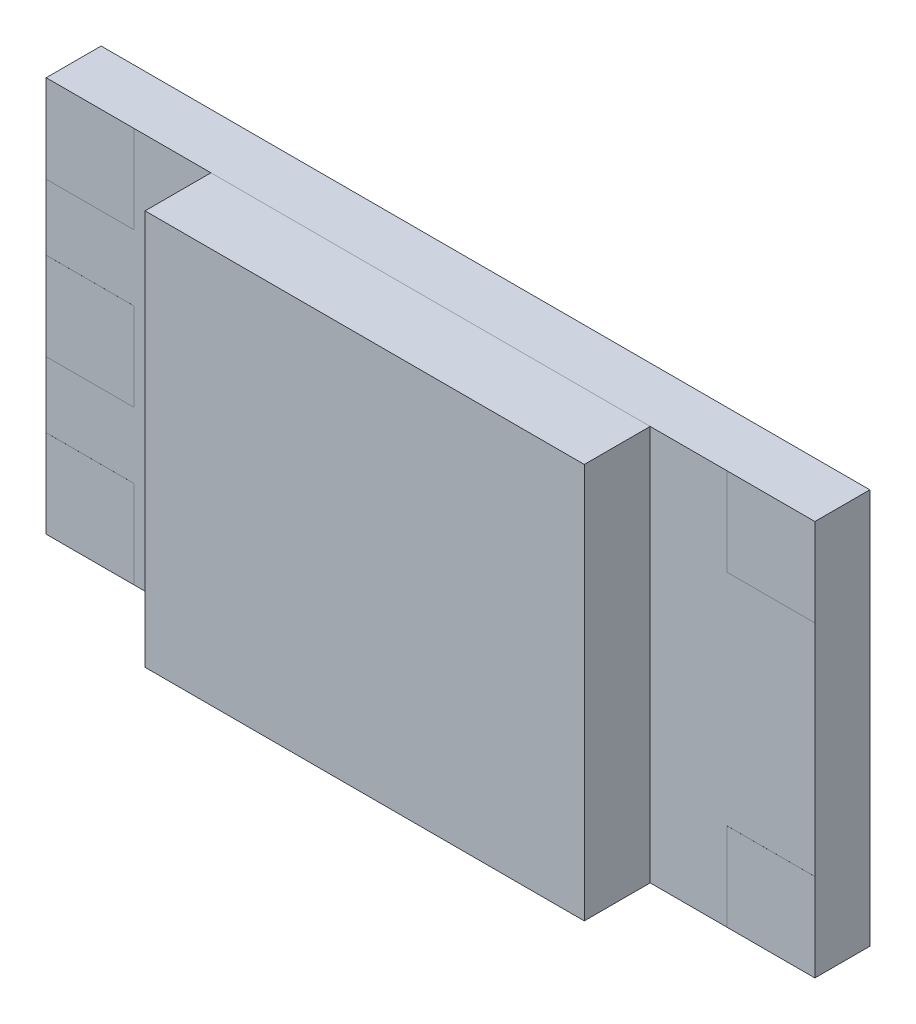
ISO-10303-21;
HEADER;
FILE_DESCRIPTION(('STEP AP214'),'2;1');
FILE_NAME('part.step','',(''),(''),'','','');
FILE_SCHEMA(('AUTOMOTIVE_DESIGN { 1 0 10303 214 1 1 1 1 }'));
ENDSEC;
DATA;
#1=APPLICATION_CONTEXT('core data for automotive mechanical design processes');
#2=APPLICATION_PROTOCOL_DEFINITION('international standard','automotive_design',2000,#1);
#3=PRODUCT_CONTEXT('',#1,'mechanical');
#4=PRODUCT('Part','Part','',(#3));
#5=PRODUCT_RELATED_PRODUCT_CATEGORY('part','',(#4));
#6=PRODUCT_DEFINITION_FORMATION('','',#4);
#7=PRODUCT_DEFINITION_CONTEXT('part definition',#1,'design');
#8=PRODUCT_DEFINITION('design','',#6,#7);
#9=PRODUCT_DEFINITION_SHAPE('','',#8);
#10=(LENGTH_UNIT() NAMED_UNIT(*) SI_UNIT(.MILLI.,.METRE.));
#11=(NAMED_UNIT(*) PLANE_ANGLE_UNIT() SI_UNIT($,.RADIAN.));
#12=(NAMED_UNIT(*) SI_UNIT($,.STERADIAN.) SOLID_ANGLE_UNIT());
#13=UNCERTAINTY_MEASURE_WITH_UNIT(LENGTH_MEASURE(1.E-05),#10,'distance_accuracy_value','');
#14=(GEOMETRIC_REPRESENTATION_CONTEXT(3) GLOBAL_UNCERTAINTY_ASSIGNED_CONTEXT((#13)) GLOBAL_UNIT_ASSIGNED_CONTEXT((#10,
#11,#12)) REPRESENTATION_CONTEXT('',''));
#15=CARTESIAN_POINT('',(0.,0.,0.));
#16=DIRECTION('',(0.,0.,1.));
#17=DIRECTION('',(1.,0.,0.));
#18=AXIS2_PLACEMENT_3D('',#15,#16,#17);
#19=CARTESIAN_POINT('',(35.,0.,2.501));
#20=DIRECTION('',(-1.,0.,0.));
#21=DIRECTION('',(0.,0.,1.));
#22=AXIS2_PLACEMENT_3D('',#19,#20,#21);
#23=PLANE('',#22);
#24=DIRECTION('',(0.,1.,0.));
#25=VECTOR('',#24,1.);
#26=CARTESIAN_POINT('',(35.,0.,2.5));
#27=LINE('',#26,#25);
#28=CARTESIAN_POINT('',(35.,0.,2.5));
#29=VERTEX_POINT('',#28);
#30=CARTESIAN_POINT('',(35.,4.,2.5));
#31=VERTEX_POINT('',#30);
#32=EDGE_CURVE('E117',#29,#31,#27,.T.);
#33=ORIENTED_EDGE('',*,*,#32,.T.);
#34=DIRECTION('',(0.,0.,-1.));
#35=VECTOR('',#34,1.);
#36=CARTESIAN_POINT('',(35.,4.,2.501));
#37=LINE('',#36,#35);
#38=CARTESIAN_POINT('',(35.,4.,2.501));
#39=VERTEX_POINT('',#38);
#40=EDGE_CURVE('E12',#39,#31,#37,.T.);
#41=ORIENTED_EDGE('',*,*,#40,.F.);
#42=DIRECTION('',(0.,1.,0.));
#43=VECTOR('',#42,1.);
#44=CARTESIAN_POINT('',(35.,0.,2.501));
#45=LINE('',#44,#43);
#46=CARTESIAN_POINT('',(35.,0.,2.501));
#47=VERTEX_POINT('',#46);
#48=EDGE_CURVE('E105',#47,#39,#45,.T.);
#49=ORIENTED_EDGE('',*,*,#48,.F.);
#50=DIRECTION('',(0.,0.,-1.));
#51=VECTOR('',#50,1.);
#52=CARTESIAN_POINT('',(35.,0.,2.501));
#53=LINE('',#52,#51);
#54=EDGE_CURVE('E113',#47,#29,#53,.T.);
#55=ORIENTED_EDGE('',*,*,#54,.T.);
#56=EDGE_LOOP('',(#33,#41,#49,#55));
#57=FACE_BOUND('',#56,.T.);
#58=ADVANCED_FACE('F54',(#57),#23,.F.);
#59=CARTESIAN_POINT('',(35.,4.,2.501));
#60=DIRECTION('',(0.,-1.,0.));
#61=DIRECTION('',(1.,0.,0.));
#62=AXIS2_PLACEMENT_3D('',#59,#60,#61);
#63=PLANE('',#62);
#64=DIRECTION('',(-1.,0.,0.));
#65=VECTOR('',#64,1.);
#66=CARTESIAN_POINT('',(35.,4.,2.5));
#67=LINE('',#66,#65);
#68=CARTESIAN_POINT('',(31.,4.,2.5));
#69=VERTEX_POINT('',#68);
#70=EDGE_CURVE('E109',#31,#69,#67,.T.);
#71=ORIENTED_EDGE('',*,*,#70,.T.);
#72=DIRECTION('',(0.,0.,-1.));
#73=VECTOR('',#72,1.);
#74=CARTESIAN_POINT('',(31.,4.,2.501));
#75=LINE('',#74,#73);
#76=CARTESIAN_POINT('',(31.,4.,2.501));
#77=VERTEX_POINT('',#76);
#78=EDGE_CURVE('E62',#77,#69,#75,.T.);
#79=ORIENTED_EDGE('',*,*,#78,.F.);
#80=DIRECTION('',(-1.,0.,0.));
#81=VECTOR('',#80,1.);
#82=CARTESIAN_POINT('',(35.,4.,2.501));
#83=LINE('',#82,#81);
#84=EDGE_CURVE('E100',#39,#77,#83,.T.);
#85=ORIENTED_EDGE('',*,*,#84,.F.);
#86=ORIENTED_EDGE('',*,*,#40,.T.);
#87=EDGE_LOOP('',(#71,#79,#85,#86));
#88=FACE_BOUND('',#87,.T.);
#89=ADVANCED_FACE('F108',(#88),#63,.F.);
#90=CARTESIAN_POINT('',(31.,0.,2.501));
#91=DIRECTION('',(1.,0.,0.));
#92=DIRECTION('',(0.,0.,-1.));
#93=AXIS2_PLACEMENT_3D('',#90,#91,#92);
#94=PLANE('',#93);
#95=DIRECTION('',(0.,-1.,0.));
#96=VECTOR('',#95,1.);
#97=CARTESIAN_POINT('',(31.,0.,2.5));
#98=LINE('',#97,#96);
#99=CARTESIAN_POINT('',(31.,0.,2.5));
#100=VERTEX_POINT('',#99);
#101=EDGE_CURVE('E87',#69,#100,#98,.T.);
#102=ORIENTED_EDGE('',*,*,#101,.T.);
#103=DIRECTION('',(0.,0.,-1.));
#104=VECTOR('',#103,1.);
#105=CARTESIAN_POINT('',(31.,0.,2.501));
#106=LINE('',#105,#104);
#107=CARTESIAN_POINT('',(31.,0.,2.501));
#108=VERTEX_POINT('',#107);
#109=EDGE_CURVE('E110',#108,#100,#106,.T.);
#110=ORIENTED_EDGE('',*,*,#109,.F.);
#111=DIRECTION('',(0.,-1.,0.));
#112=VECTOR('',#111,1.);
#113=CARTESIAN_POINT('',(31.,0.,2.501));
#114=LINE('',#113,#112);
#115=EDGE_CURVE('E103',#77,#108,#114,.T.);
#116=ORIENTED_EDGE('',*,*,#115,.F.);
#117=ORIENTED_EDGE('',*,*,#78,.T.);
#118=EDGE_LOOP('',(#102,#110,#116,#117));
#119=FACE_BOUND('',#118,.T.);
#120=ADVANCED_FACE('F111',(#119),#94,.F.);
#121=CARTESIAN_POINT('',(35.,0.,2.501));
#122=DIRECTION('',(0.,1.,0.));
#123=DIRECTION('',(-1.,0.,0.));
#124=AXIS2_PLACEMENT_3D('',#121,#122,#123);
#125=PLANE('',#124);
#126=DIRECTION('',(1.,0.,0.));
#127=VECTOR('',#126,1.);
#128=CARTESIAN_POINT('',(35.,0.,2.5));
#129=LINE('',#128,#127);
#130=EDGE_CURVE('E93',#100,#29,#129,.T.);
#131=ORIENTED_EDGE('',*,*,#130,.T.);
#132=ORIENTED_EDGE('',*,*,#54,.F.);
#133=DIRECTION('',(1.,0.,0.));
#134=VECTOR('',#133,1.);
#135=CARTESIAN_POINT('',(35.,0.,2.501));
#136=LINE('',#135,#134);
#137=EDGE_CURVE('E70',#108,#47,#136,.T.);
#138=ORIENTED_EDGE('',*,*,#137,.F.);
#139=ORIENTED_EDGE('',*,*,#109,.T.);
#140=EDGE_LOOP('',(#131,#132,#138,#139));
#141=FACE_BOUND('',#140,.T.);
#142=ADVANCED_FACE('F124',(#141),#125,.F.);
#143=CARTESIAN_POINT('',(0.,0.,2.501));
#144=DIRECTION('',(0.,0.,1.));
#145=DIRECTION('',(1.,0.,0.));
#146=AXIS2_PLACEMENT_3D('',#143,#144,#145);
#147=PLANE('',#146);
#148=ORIENTED_EDGE('',*,*,#48,.T.);
#149=ORIENTED_EDGE('',*,*,#84,.T.);
#150=ORIENTED_EDGE('',*,*,#115,.T.);
#151=ORIENTED_EDGE('',*,*,#137,.T.);
#152=EDGE_LOOP('',(#148,#149,#150,#151));
#153=FACE_BOUND('',#152,.T.);
#154=ADVANCED_FACE('F101',(#153),#147,.T.);
#155=CARTESIAN_POINT('',(0.,0.,2.5));
#156=DIRECTION('',(0.,0.,1.));
#157=DIRECTION('',(1.,0.,0.));
#158=AXIS2_PLACEMENT_3D('',#155,#156,#157);
#159=PLANE('',#158);
#160=ORIENTED_EDGE('',*,*,#32,.F.);
#161=ORIENTED_EDGE('',*,*,#130,.F.);
#162=ORIENTED_EDGE('',*,*,#101,.F.);
#163=ORIENTED_EDGE('',*,*,#70,.F.);
#164=EDGE_LOOP('',(#160,#161,#162,#163));
#165=FACE_BOUND('',#164,.T.);
#166=ADVANCED_FACE('F127',(#165),#159,.F.);
#167=CLOSED_SHELL('',(#58,#89,#120,#142,#154,#166));
#168=MANIFOLD_SOLID_BREP('B2',#167);
#169=CARTESIAN_POINT('',(35.,18.,2.501));
#170=DIRECTION('',(-1.,0.,0.));
#171=DIRECTION('',(0.,0.,1.));
#172=AXIS2_PLACEMENT_3D('',#169,#170,#171);
#173=PLANE('',#172);
#174=DIRECTION('',(0.,1.,0.));
#175=VECTOR('',#174,1.);
#176=CARTESIAN_POINT('',(35.,18.,2.5));
#177=LINE('',#176,#175);
#178=CARTESIAN_POINT('',(35.,14.,2.5));
#179=VERTEX_POINT('',#178);
#180=CARTESIAN_POINT('',(35.,18.,2.5));
#181=VERTEX_POINT('',#180);
#182=EDGE_CURVE('E263',#179,#181,#177,.T.);
#183=ORIENTED_EDGE('',*,*,#182,.T.);
#184=DIRECTION('',(0.,0.,-1.));
#185=VECTOR('',#184,1.);
#186=CARTESIAN_POINT('',(35.,18.,2.501));
#187=LINE('',#186,#185);
#188=CARTESIAN_POINT('',(35.,18.,2.501));
#189=VERTEX_POINT('',#188);
#190=EDGE_CURVE('E52',#189,#181,#187,.T.);
#191=ORIENTED_EDGE('',*,*,#190,.F.);
#192=DIRECTION('',(0.,1.,0.));
#193=VECTOR('',#192,1.);
#194=CARTESIAN_POINT('',(35.,18.,2.501));
#195=LINE('',#194,#193);
#196=CARTESIAN_POINT('',(35.,14.,2.501));
#197=VERTEX_POINT('',#196);
#198=EDGE_CURVE('E251',#197,#189,#195,.T.);
#199=ORIENTED_EDGE('',*,*,#198,.F.);
#200=DIRECTION('',(0.,0.,-1.));
#201=VECTOR('',#200,1.);
#202=CARTESIAN_POINT('',(35.,14.,2.501));
#203=LINE('',#202,#201);
#204=EDGE_CURVE('E259',#197,#179,#203,.T.);
#205=ORIENTED_EDGE('',*,*,#204,.T.);
#206=EDGE_LOOP('',(#183,#191,#199,#205));
#207=FACE_BOUND('',#206,.T.);
#208=ADVANCED_FACE('F200',(#207),#173,.F.);
#209=CARTESIAN_POINT('',(35.,18.,2.501));
#210=DIRECTION('',(0.,-1.,0.));
#211=DIRECTION('',(0.,0.,-1.));
#212=AXIS2_PLACEMENT_3D('',#209,#210,#211);
#213=PLANE('',#212);
#214=DIRECTION('',(-1.,0.,0.));
#215=VECTOR('',#214,1.);
#216=CARTESIAN_POINT('',(35.,18.,2.5));
#217=LINE('',#216,#215);
#218=CARTESIAN_POINT('',(31.,18.,2.5));
#219=VERTEX_POINT('',#218);
#220=EDGE_CURVE('E255',#181,#219,#217,.T.);
#221=ORIENTED_EDGE('',*,*,#220,.T.);
#222=DIRECTION('',(0.,0.,-1.));
#223=VECTOR('',#222,1.);
#224=CARTESIAN_POINT('',(31.,18.,2.501));
#225=LINE('',#224,#223);
#226=CARTESIAN_POINT('',(31.,18.,2.501));
#227=VERTEX_POINT('',#226);
#228=EDGE_CURVE('E208',#227,#219,#225,.T.);
#229=ORIENTED_EDGE('',*,*,#228,.F.);
#230=DIRECTION('',(-1.,0.,0.));
#231=VECTOR('',#230,1.);
#232=CARTESIAN_POINT('',(35.,18.,2.501));
#233=LINE('',#232,#231);
#234=EDGE_CURVE('E246',#189,#227,#233,.T.);
#235=ORIENTED_EDGE('',*,*,#234,.F.);
#236=ORIENTED_EDGE('',*,*,#190,.T.);
#237=EDGE_LOOP('',(#221,#229,#235,#236));
#238=FACE_BOUND('',#237,.T.);
#239=ADVANCED_FACE('F254',(#238),#213,.F.);
#240=CARTESIAN_POINT('',(31.,18.,2.501));
#241=DIRECTION('',(1.,0.,0.));
#242=DIRECTION('',(0.,1.,0.));
#243=AXIS2_PLACEMENT_3D('',#240,#241,#242);
#244=PLANE('',#243);
#245=DIRECTION('',(0.,-1.,0.));
#246=VECTOR('',#245,1.);
#247=CARTESIAN_POINT('',(31.,18.,2.5));
#248=LINE('',#247,#246);
#249=CARTESIAN_POINT('',(31.,14.,2.5));
#250=VERTEX_POINT('',#249);
#251=EDGE_CURVE('E233',#219,#250,#248,.T.);
#252=ORIENTED_EDGE('',*,*,#251,.T.);
#253=DIRECTION('',(0.,0.,-1.));
#254=VECTOR('',#253,1.);
#255=CARTESIAN_POINT('',(31.,14.,2.501));
#256=LINE('',#255,#254);
#257=CARTESIAN_POINT('',(31.,14.,2.501));
#258=VERTEX_POINT('',#257);
#259=EDGE_CURVE('E256',#258,#250,#256,.T.);
#260=ORIENTED_EDGE('',*,*,#259,.F.);
#261=DIRECTION('',(0.,-1.,0.));
#262=VECTOR('',#261,1.);
#263=CARTESIAN_POINT('',(31.,18.,2.501));
#264=LINE('',#263,#262);
#265=EDGE_CURVE('E249',#227,#258,#264,.T.);
#266=ORIENTED_EDGE('',*,*,#265,.F.);
#267=ORIENTED_EDGE('',*,*,#228,.T.);
#268=EDGE_LOOP('',(#252,#260,#266,#267));
#269=FACE_BOUND('',#268,.T.);
#270=ADVANCED_FACE('F257',(#269),#244,.F.);
#271=CARTESIAN_POINT('',(35.,14.,2.501));
#272=DIRECTION('',(0.,1.,0.));
#273=DIRECTION('',(0.,0.,1.));
#274=AXIS2_PLACEMENT_3D('',#271,#272,#273);
#275=PLANE('',#274);
#276=DIRECTION('',(1.,0.,0.));
#277=VECTOR('',#276,1.);
#278=CARTESIAN_POINT('',(35.,14.,2.5));
#279=LINE('',#278,#277);
#280=EDGE_CURVE('E239',#250,#179,#279,.T.);
#281=ORIENTED_EDGE('',*,*,#280,.T.);
#282=ORIENTED_EDGE('',*,*,#204,.F.);
#283=DIRECTION('',(1.,0.,0.));
#284=VECTOR('',#283,1.);
#285=CARTESIAN_POINT('',(35.,14.,2.501));
#286=LINE('',#285,#284);
#287=EDGE_CURVE('E216',#258,#197,#286,.T.);
#288=ORIENTED_EDGE('',*,*,#287,.F.);
#289=ORIENTED_EDGE('',*,*,#259,.T.);
#290=EDGE_LOOP('',(#281,#282,#288,#289));
#291=FACE_BOUND('',#290,.T.);
#292=ADVANCED_FACE('F270',(#291),#275,.F.);
#293=CARTESIAN_POINT('',(0.,0.,2.501));
#294=DIRECTION('',(0.,0.,-1.));
#295=DIRECTION('',(-1.,0.,0.));
#296=AXIS2_PLACEMENT_3D('',#293,#294,#295);
#297=PLANE('',#296);
#298=ORIENTED_EDGE('',*,*,#198,.T.);
#299=ORIENTED_EDGE('',*,*,#234,.T.);
#300=ORIENTED_EDGE('',*,*,#265,.T.);
#301=ORIENTED_EDGE('',*,*,#287,.T.);
#302=EDGE_LOOP('',(#298,#299,#300,#301));
#303=FACE_BOUND('',#302,.T.);
#304=ADVANCED_FACE('F247',(#303),#297,.F.);
#305=CARTESIAN_POINT('',(0.,0.,2.5));
#306=DIRECTION('',(0.,0.,-1.));
#307=DIRECTION('',(-1.,0.,0.));
#308=AXIS2_PLACEMENT_3D('',#305,#306,#307);
#309=PLANE('',#308);
#310=ORIENTED_EDGE('',*,*,#182,.F.);
#311=ORIENTED_EDGE('',*,*,#280,.F.);
#312=ORIENTED_EDGE('',*,*,#251,.F.);
#313=ORIENTED_EDGE('',*,*,#220,.F.);
#314=EDGE_LOOP('',(#310,#311,#312,#313));
#315=FACE_BOUND('',#314,.T.);
#316=ADVANCED_FACE('F273',(#315),#309,.T.);
#317=CLOSED_SHELL('',(#208,#239,#270,#292,#304,#316));
#318=MANIFOLD_SOLID_BREP('B6',#317);
#319=CARTESIAN_POINT('',(0.,0.,2.501));
#320=DIRECTION('',(1.,0.,0.));
#321=DIRECTION('',(0.,0.,-1.));
#322=AXIS2_PLACEMENT_3D('',#319,#320,#321);
#323=PLANE('',#322);
#324=DIRECTION('',(0.,-1.,0.));
#325=VECTOR('',#324,1.);
#326=CARTESIAN_POINT('',(0.,0.,2.5));
#327=LINE('',#326,#325);
#328=CARTESIAN_POINT('',(0.,4.,2.5));
#329=VERTEX_POINT('',#328);
#330=CARTESIAN_POINT('',(0.,0.,2.5));
#331=VERTEX_POINT('',#330);
#332=EDGE_CURVE('E409',#329,#331,#327,.T.);
#333=ORIENTED_EDGE('',*,*,#332,.T.);
#334=DIRECTION('',(0.,0.,-1.));
#335=VECTOR('',#334,1.);
#336=CARTESIAN_POINT('',(0.,0.,2.501));
#337=LINE('',#336,#335);
#338=CARTESIAN_POINT('',(0.,0.,2.501));
#339=VERTEX_POINT('',#338);
#340=EDGE_CURVE('E198',#339,#331,#337,.T.);
#341=ORIENTED_EDGE('',*,*,#340,.F.);
#342=DIRECTION('',(0.,-1.,0.));
#343=VECTOR('',#342,1.);
#344=CARTESIAN_POINT('',(0.,0.,2.501));
#345=LINE('',#344,#343);
#346=CARTESIAN_POINT('',(0.,4.,2.501));
#347=VERTEX_POINT('',#346);
#348=EDGE_CURVE('E397',#347,#339,#345,.T.);
#349=ORIENTED_EDGE('',*,*,#348,.F.);
#350=DIRECTION('',(0.,0.,-1.));
#351=VECTOR('',#350,1.);
#352=CARTESIAN_POINT('',(0.,4.,2.501));
#353=LINE('',#352,#351);
#354=EDGE_CURVE('E405',#347,#329,#353,.T.);
#355=ORIENTED_EDGE('',*,*,#354,.T.);
#356=EDGE_LOOP('',(#333,#341,#349,#355));
#357=FACE_BOUND('',#356,.T.);
#358=ADVANCED_FACE('F346',(#357),#323,.F.);
#359=CARTESIAN_POINT('',(0.,0.,2.501));
#360=DIRECTION('',(0.,1.,0.));
#361=DIRECTION('',(0.,0.,1.));
#362=AXIS2_PLACEMENT_3D('',#359,#360,#361);
#363=PLANE('',#362);
#364=DIRECTION('',(1.,0.,0.));
#365=VECTOR('',#364,1.);
#366=CARTESIAN_POINT('',(0.,0.,2.5));
#367=LINE('',#366,#365);
#368=CARTESIAN_POINT('',(4.,0.,2.5));
#369=VERTEX_POINT('',#368);
#370=EDGE_CURVE('E401',#331,#369,#367,.T.);
#371=ORIENTED_EDGE('',*,*,#370,.T.);
#372=DIRECTION('',(0.,0.,-1.));
#373=VECTOR('',#372,1.);
#374=CARTESIAN_POINT('',(4.,0.,2.501));
#375=LINE('',#374,#373);
#376=CARTESIAN_POINT('',(4.,0.,2.501));
#377=VERTEX_POINT('',#376);
#378=EDGE_CURVE('E354',#377,#369,#375,.T.);
#379=ORIENTED_EDGE('',*,*,#378,.F.);
#380=DIRECTION('',(1.,0.,0.));
#381=VECTOR('',#380,1.);
#382=CARTESIAN_POINT('',(0.,0.,2.501));
#383=LINE('',#382,#381);
#384=EDGE_CURVE('E392',#339,#377,#383,.T.);
#385=ORIENTED_EDGE('',*,*,#384,.F.);
#386=ORIENTED_EDGE('',*,*,#340,.T.);
#387=EDGE_LOOP('',(#371,#379,#385,#386));
#388=FACE_BOUND('',#387,.T.);
#389=ADVANCED_FACE('F400',(#388),#363,.F.);
#390=CARTESIAN_POINT('',(4.,0.,2.501));
#391=DIRECTION('',(-1.,0.,0.));
#392=DIRECTION('',(0.,0.,1.));
#393=AXIS2_PLACEMENT_3D('',#390,#391,#392);
#394=PLANE('',#393);
#395=DIRECTION('',(0.,1.,0.));
#396=VECTOR('',#395,1.);
#397=CARTESIAN_POINT('',(4.,0.,2.5));
#398=LINE('',#397,#396);
#399=CARTESIAN_POINT('',(4.,4.,2.5));
#400=VERTEX_POINT('',#399);
#401=EDGE_CURVE('E379',#369,#400,#398,.T.);
#402=ORIENTED_EDGE('',*,*,#401,.T.);
#403=DIRECTION('',(0.,0.,-1.));
#404=VECTOR('',#403,1.);
#405=CARTESIAN_POINT('',(4.,4.,2.501));
#406=LINE('',#405,#404);
#407=CARTESIAN_POINT('',(4.,4.,2.501));
#408=VERTEX_POINT('',#407);
#409=EDGE_CURVE('E402',#408,#400,#406,.T.);
#410=ORIENTED_EDGE('',*,*,#409,.F.);
#411=DIRECTION('',(0.,1.,0.));
#412=VECTOR('',#411,1.);
#413=CARTESIAN_POINT('',(4.,0.,2.501));
#414=LINE('',#413,#412);
#415=EDGE_CURVE('E395',#377,#408,#414,.T.);
#416=ORIENTED_EDGE('',*,*,#415,.F.);
#417=ORIENTED_EDGE('',*,*,#378,.T.);
#418=EDGE_LOOP('',(#402,#410,#416,#417));
#419=FACE_BOUND('',#418,.T.);
#420=ADVANCED_FACE('F403',(#419),#394,.F.);
#421=CARTESIAN_POINT('',(0.,4.,2.501));
#422=DIRECTION('',(0.,-1.,0.));
#423=DIRECTION('',(0.,0.,-1.));
#424=AXIS2_PLACEMENT_3D('',#421,#422,#423);
#425=PLANE('',#424);
#426=DIRECTION('',(-1.,0.,0.));
#427=VECTOR('',#426,1.);
#428=CARTESIAN_POINT('',(0.,4.,2.5));
#429=LINE('',#428,#427);
#430=EDGE_CURVE('E385',#400,#329,#429,.T.);
#431=ORIENTED_EDGE('',*,*,#430,.T.);
#432=ORIENTED_EDGE('',*,*,#354,.F.);
#433=DIRECTION('',(-1.,0.,0.));
#434=VECTOR('',#433,1.);
#435=CARTESIAN_POINT('',(0.,4.,2.501));
#436=LINE('',#435,#434);
#437=EDGE_CURVE('E362',#408,#347,#436,.T.);
#438=ORIENTED_EDGE('',*,*,#437,.F.);
#439=ORIENTED_EDGE('',*,*,#409,.T.);
#440=EDGE_LOOP('',(#431,#432,#438,#439));
#441=FACE_BOUND('',#440,.T.);
#442=ADVANCED_FACE('F416',(#441),#425,.F.);
#443=CARTESIAN_POINT('',(0.,0.,2.501));
#444=DIRECTION('',(0.,0.,-1.));
#445=DIRECTION('',(-1.,0.,0.));
#446=AXIS2_PLACEMENT_3D('',#443,#444,#445);
#447=PLANE('',#446);
#448=ORIENTED_EDGE('',*,*,#348,.T.);
#449=ORIENTED_EDGE('',*,*,#384,.T.);
#450=ORIENTED_EDGE('',*,*,#415,.T.);
#451=ORIENTED_EDGE('',*,*,#437,.T.);
#452=EDGE_LOOP('',(#448,#449,#450,#451));
#453=FACE_BOUND('',#452,.T.);
#454=ADVANCED_FACE('F393',(#453),#447,.F.);
#455=CARTESIAN_POINT('',(0.,0.,2.5));
#456=DIRECTION('',(0.,0.,-1.));
#457=DIRECTION('',(-1.,0.,0.));
#458=AXIS2_PLACEMENT_3D('',#455,#456,#457);
#459=PLANE('',#458);
#460=ORIENTED_EDGE('',*,*,#332,.F.);
#461=ORIENTED_EDGE('',*,*,#430,.F.);
#462=ORIENTED_EDGE('',*,*,#401,.F.);
#463=ORIENTED_EDGE('',*,*,#370,.F.);
#464=EDGE_LOOP('',(#460,#461,#462,#463));
#465=FACE_BOUND('',#464,.T.);
#466=ADVANCED_FACE('F419',(#465),#459,.T.);
#467=CLOSED_SHELL('',(#358,#389,#420,#442,#454,#466));
#468=MANIFOLD_SOLID_BREP('B46',#467);
#469=CARTESIAN_POINT('',(0.,11.,2.501));
#470=DIRECTION('',(1.,0.,0.));
#471=DIRECTION('',(0.,1.,0.));
#472=AXIS2_PLACEMENT_3D('',#469,#470,#471);
#473=PLANE('',#472);
#474=DIRECTION('',(0.,-1.,0.));
#475=VECTOR('',#474,1.);
#476=CARTESIAN_POINT('',(0.,11.,2.5));
#477=LINE('',#476,#475);
#478=CARTESIAN_POINT('',(0.,11.,2.5));
#479=VERTEX_POINT('',#478);
#480=CARTESIAN_POINT('',(0.,7.,2.5));
#481=VERTEX_POINT('',#480);
#482=EDGE_CURVE('E555',#479,#481,#477,.T.);
#483=ORIENTED_EDGE('',*,*,#482,.T.);
#484=DIRECTION('',(0.,0.,-1.));
#485=VECTOR('',#484,1.);
#486=CARTESIAN_POINT('',(0.,7.,2.501));
#487=LINE('',#486,#485);
#488=CARTESIAN_POINT('',(0.,7.,2.501));
#489=VERTEX_POINT('',#488);
#490=EDGE_CURVE('E344',#489,#481,#487,.T.);
#491=ORIENTED_EDGE('',*,*,#490,.F.);
#492=DIRECTION('',(0.,-1.,0.));
#493=VECTOR('',#492,1.);
#494=CARTESIAN_POINT('',(0.,11.,2.501));
#495=LINE('',#494,#493);
#496=CARTESIAN_POINT('',(0.,11.,2.501));
#497=VERTEX_POINT('',#496);
#498=EDGE_CURVE('E543',#497,#489,#495,.T.);
#499=ORIENTED_EDGE('',*,*,#498,.F.);
#500=DIRECTION('',(0.,0.,-1.));
#501=VECTOR('',#500,1.);
#502=CARTESIAN_POINT('',(0.,11.,2.501));
#503=LINE('',#502,#501);
#504=EDGE_CURVE('E551',#497,#479,#503,.T.);
#505=ORIENTED_EDGE('',*,*,#504,.T.);
#506=EDGE_LOOP('',(#483,#491,#499,#505));
#507=FACE_BOUND('',#506,.T.);
#508=ADVANCED_FACE('F492',(#507),#473,.F.);
#509=CARTESIAN_POINT('',(0.,7.,2.501));
#510=DIRECTION('',(0.,1.,0.));
#511=DIRECTION('',(-1.,0.,0.));
#512=AXIS2_PLACEMENT_3D('',#509,#510,#511);
#513=PLANE('',#512);
#514=DIRECTION('',(1.,0.,0.));
#515=VECTOR('',#514,1.);
#516=CARTESIAN_POINT('',(0.,7.,2.5));
#517=LINE('',#516,#515);
#518=CARTESIAN_POINT('',(4.,7.,2.5));
#519=VERTEX_POINT('',#518);
#520=EDGE_CURVE('E547',#481,#519,#517,.T.);
#521=ORIENTED_EDGE('',*,*,#520,.T.);
#522=DIRECTION('',(0.,0.,-1.));
#523=VECTOR('',#522,1.);
#524=CARTESIAN_POINT('',(4.,7.,2.501));
#525=LINE('',#524,#523);
#526=CARTESIAN_POINT('',(4.,7.,2.501));
#527=VERTEX_POINT('',#526);
#528=EDGE_CURVE('E500',#527,#519,#525,.T.);
#529=ORIENTED_EDGE('',*,*,#528,.F.);
#530=DIRECTION('',(1.,0.,0.));
#531=VECTOR('',#530,1.);
#532=CARTESIAN_POINT('',(0.,7.,2.501));
#533=LINE('',#532,#531);
#534=EDGE_CURVE('E538',#489,#527,#533,.T.);
#535=ORIENTED_EDGE('',*,*,#534,.F.);
#536=ORIENTED_EDGE('',*,*,#490,.T.);
#537=EDGE_LOOP('',(#521,#529,#535,#536));
#538=FACE_BOUND('',#537,.T.);
#539=ADVANCED_FACE('F546',(#538),#513,.F.);
#540=CARTESIAN_POINT('',(4.,11.,2.501));
#541=DIRECTION('',(-1.,0.,0.));
#542=DIRECTION('',(0.,0.,1.));
#543=AXIS2_PLACEMENT_3D('',#540,#541,#542);
#544=PLANE('',#543);
#545=DIRECTION('',(0.,1.,0.));
#546=VECTOR('',#545,1.);
#547=CARTESIAN_POINT('',(4.,11.,2.5));
#548=LINE('',#547,#546);
#549=CARTESIAN_POINT('',(4.,11.,2.5));
#550=VERTEX_POINT('',#549);
#551=EDGE_CURVE('E525',#519,#550,#548,.T.);
#552=ORIENTED_EDGE('',*,*,#551,.T.);
#553=DIRECTION('',(0.,0.,-1.));
#554=VECTOR('',#553,1.);
#555=CARTESIAN_POINT('',(4.,11.,2.501));
#556=LINE('',#555,#554);
#557=CARTESIAN_POINT('',(4.,11.,2.501));
#558=VERTEX_POINT('',#557);
#559=EDGE_CURVE('E548',#558,#550,#556,.T.);
#560=ORIENTED_EDGE('',*,*,#559,.F.);
#561=DIRECTION('',(0.,1.,0.));
#562=VECTOR('',#561,1.);
#563=CARTESIAN_POINT('',(4.,11.,2.501));
#564=LINE('',#563,#562);
#565=EDGE_CURVE('E541',#527,#558,#564,.T.);
#566=ORIENTED_EDGE('',*,*,#565,.F.);
#567=ORIENTED_EDGE('',*,*,#528,.T.);
#568=EDGE_LOOP('',(#552,#560,#566,#567));
#569=FACE_BOUND('',#568,.T.);
#570=ADVANCED_FACE('F549',(#569),#544,.F.);
#571=CARTESIAN_POINT('',(0.,11.,2.501));
#572=DIRECTION('',(0.,-1.,0.));
#573=DIRECTION('',(1.,0.,0.));
#574=AXIS2_PLACEMENT_3D('',#571,#572,#573);
#575=PLANE('',#574);
#576=DIRECTION('',(-1.,0.,0.));
#577=VECTOR('',#576,1.);
#578=CARTESIAN_POINT('',(0.,11.,2.5));
#579=LINE('',#578,#577);
#580=EDGE_CURVE('E531',#550,#479,#579,.T.);
#581=ORIENTED_EDGE('',*,*,#580,.T.);
#582=ORIENTED_EDGE('',*,*,#504,.F.);
#583=DIRECTION('',(-1.,0.,0.));
#584=VECTOR('',#583,1.);
#585=CARTESIAN_POINT('',(0.,11.,2.501));
#586=LINE('',#585,#584);
#587=EDGE_CURVE('E508',#558,#497,#586,.T.);
#588=ORIENTED_EDGE('',*,*,#587,.F.);
#589=ORIENTED_EDGE('',*,*,#559,.T.);
#590=EDGE_LOOP('',(#581,#582,#588,#589));
#591=FACE_BOUND('',#590,.T.);
#592=ADVANCED_FACE('F562',(#591),#575,.F.);
#593=CARTESIAN_POINT('',(0.,0.,2.501));
#594=DIRECTION('',(0.,0.,1.));
#595=DIRECTION('',(1.,0.,0.));
#596=AXIS2_PLACEMENT_3D('',#593,#594,#595);
#597=PLANE('',#596);
#598=ORIENTED_EDGE('',*,*,#498,.T.);
#599=ORIENTED_EDGE('',*,*,#534,.T.);
#600=ORIENTED_EDGE('',*,*,#565,.T.);
#601=ORIENTED_EDGE('',*,*,#587,.T.);
#602=EDGE_LOOP('',(#598,#599,#600,#601));
#603=FACE_BOUND('',#602,.T.);
#604=ADVANCED_FACE('F539',(#603),#597,.T.);
#605=CARTESIAN_POINT('',(0.,0.,2.5));
#606=DIRECTION('',(0.,0.,1.));
#607=DIRECTION('',(1.,0.,0.));
#608=AXIS2_PLACEMENT_3D('',#605,#606,#607);
#609=PLANE('',#608);
#610=ORIENTED_EDGE('',*,*,#482,.F.);
#611=ORIENTED_EDGE('',*,*,#580,.F.);
#612=ORIENTED_EDGE('',*,*,#551,.F.);
#613=ORIENTED_EDGE('',*,*,#520,.F.);
#614=EDGE_LOOP('',(#610,#611,#612,#613));
#615=FACE_BOUND('',#614,.T.);
#616=ADVANCED_FACE('F565',(#615),#609,.F.);
#617=CLOSED_SHELL('',(#508,#539,#570,#592,#604,#616));
#618=MANIFOLD_SOLID_BREP('B192',#617);
#619=CARTESIAN_POINT('',(0.,18.,2.501));
#620=DIRECTION('',(1.,0.,0.));
#621=DIRECTION('',(0.,1.,0.));
#622=AXIS2_PLACEMENT_3D('',#619,#620,#621);
#623=PLANE('',#622);
#624=DIRECTION('',(0.,-1.,0.));
#625=VECTOR('',#624,1.);
#626=CARTESIAN_POINT('',(0.,18.,2.5));
#627=LINE('',#626,#625);
#628=CARTESIAN_POINT('',(0.,18.,2.5));
#629=VERTEX_POINT('',#628);
#630=CARTESIAN_POINT('',(0.,14.,2.5));
#631=VERTEX_POINT('',#630);
#632=EDGE_CURVE('E701',#629,#631,#627,.T.);
#633=ORIENTED_EDGE('',*,*,#632,.T.);
#634=DIRECTION('',(0.,0.,-1.));
#635=VECTOR('',#634,1.);
#636=CARTESIAN_POINT('',(0.,14.,2.501));
#637=LINE('',#636,#635);
#638=CARTESIAN_POINT('',(0.,14.,2.501));
#639=VERTEX_POINT('',#638);
#640=EDGE_CURVE('E490',#639,#631,#637,.T.);
#641=ORIENTED_EDGE('',*,*,#640,.F.);
#642=DIRECTION('',(0.,-1.,0.));
#643=VECTOR('',#642,1.);
#644=CARTESIAN_POINT('',(0.,18.,2.501));
#645=LINE('',#644,#643);
#646=CARTESIAN_POINT('',(0.,18.,2.501));
#647=VERTEX_POINT('',#646);
#648=EDGE_CURVE('E689',#647,#639,#645,.T.);
#649=ORIENTED_EDGE('',*,*,#648,.F.);
#650=DIRECTION('',(0.,0.,-1.));
#651=VECTOR('',#650,1.);
#652=CARTESIAN_POINT('',(0.,18.,2.501));
#653=LINE('',#652,#651);
#654=EDGE_CURVE('E697',#647,#629,#653,.T.);
#655=ORIENTED_EDGE('',*,*,#654,.T.);
#656=EDGE_LOOP('',(#633,#641,#649,#655));
#657=FACE_BOUND('',#656,.T.);
#658=ADVANCED_FACE('F638',(#657),#623,.F.);
#659=CARTESIAN_POINT('',(0.,14.,2.501));
#660=DIRECTION('',(0.,1.,0.));
#661=DIRECTION('',(0.,0.,1.));
#662=AXIS2_PLACEMENT_3D('',#659,#660,#661);
#663=PLANE('',#662);
#664=DIRECTION('',(1.,0.,0.));
#665=VECTOR('',#664,1.);
#666=CARTESIAN_POINT('',(0.,14.,2.5));
#667=LINE('',#666,#665);
#668=CARTESIAN_POINT('',(4.,14.,2.5));
#669=VERTEX_POINT('',#668);
#670=EDGE_CURVE('E693',#631,#669,#667,.T.);
#671=ORIENTED_EDGE('',*,*,#670,.T.);
#672=DIRECTION('',(0.,0.,-1.));
#673=VECTOR('',#672,1.);
#674=CARTESIAN_POINT('',(4.,14.,2.501));
#675=LINE('',#674,#673);
#676=CARTESIAN_POINT('',(4.,14.,2.501));
#677=VERTEX_POINT('',#676);
#678=EDGE_CURVE('E646',#677,#669,#675,.T.);
#679=ORIENTED_EDGE('',*,*,#678,.F.);
#680=DIRECTION('',(1.,0.,0.));
#681=VECTOR('',#680,1.);
#682=CARTESIAN_POINT('',(0.,14.,2.501));
#683=LINE('',#682,#681);
#684=EDGE_CURVE('E684',#639,#677,#683,.T.);
#685=ORIENTED_EDGE('',*,*,#684,.F.);
#686=ORIENTED_EDGE('',*,*,#640,.T.);
#687=EDGE_LOOP('',(#671,#679,#685,#686));
#688=FACE_BOUND('',#687,.T.);
#689=ADVANCED_FACE('F692',(#688),#663,.F.);
#690=CARTESIAN_POINT('',(4.,18.,2.501));
#691=DIRECTION('',(-1.,0.,0.));
#692=DIRECTION('',(0.,-1.,0.));
#693=AXIS2_PLACEMENT_3D('',#690,#691,#692);
#694=PLANE('',#693);
#695=DIRECTION('',(0.,1.,0.));
#696=VECTOR('',#695,1.);
#697=CARTESIAN_POINT('',(4.,18.,2.5));
#698=LINE('',#697,#696);
#699=CARTESIAN_POINT('',(4.,18.,2.5));
#700=VERTEX_POINT('',#699);
#701=EDGE_CURVE('E671',#669,#700,#698,.T.);
#702=ORIENTED_EDGE('',*,*,#701,.T.);
#703=DIRECTION('',(0.,0.,-1.));
#704=VECTOR('',#703,1.);
#705=CARTESIAN_POINT('',(4.,18.,2.501));
#706=LINE('',#705,#704);
#707=CARTESIAN_POINT('',(4.,18.,2.501));
#708=VERTEX_POINT('',#707);
#709=EDGE_CURVE('E694',#708,#700,#706,.T.);
#710=ORIENTED_EDGE('',*,*,#709,.F.);
#711=DIRECTION('',(0.,1.,0.));
#712=VECTOR('',#711,1.);
#713=CARTESIAN_POINT('',(4.,18.,2.501));
#714=LINE('',#713,#712);
#715=EDGE_CURVE('E687',#677,#708,#714,.T.);
#716=ORIENTED_EDGE('',*,*,#715,.F.);
#717=ORIENTED_EDGE('',*,*,#678,.T.);
#718=EDGE_LOOP('',(#702,#710,#716,#717));
#719=FACE_BOUND('',#718,.T.);
#720=ADVANCED_FACE('F695',(#719),#694,.F.);
#721=CARTESIAN_POINT('',(0.,18.,2.501));
#722=DIRECTION('',(0.,-1.,0.));
#723=DIRECTION('',(0.,0.,-1.));
#724=AXIS2_PLACEMENT_3D('',#721,#722,#723);
#725=PLANE('',#724);
#726=DIRECTION('',(-1.,0.,0.));
#727=VECTOR('',#726,1.);
#728=CARTESIAN_POINT('',(0.,18.,2.5));
#729=LINE('',#728,#727);
#730=EDGE_CURVE('E677',#700,#629,#729,.T.);
#731=ORIENTED_EDGE('',*,*,#730,.T.);
#732=ORIENTED_EDGE('',*,*,#654,.F.);
#733=DIRECTION('',(-1.,0.,0.));
#734=VECTOR('',#733,1.);
#735=CARTESIAN_POINT('',(0.,18.,2.501));
#736=LINE('',#735,#734);
#737=EDGE_CURVE('E654',#708,#647,#736,.T.);
#738=ORIENTED_EDGE('',*,*,#737,.F.);
#739=ORIENTED_EDGE('',*,*,#709,.T.);
#740=EDGE_LOOP('',(#731,#732,#738,#739));
#741=FACE_BOUND('',#740,.T.);
#742=ADVANCED_FACE('F708',(#741),#725,.F.);
#743=CARTESIAN_POINT('',(0.,0.,2.501));
#744=DIRECTION('',(0.,0.,1.));
#745=DIRECTION('',(1.,0.,0.));
#746=AXIS2_PLACEMENT_3D('',#743,#744,#745);
#747=PLANE('',#746);
#748=ORIENTED_EDGE('',*,*,#648,.T.);
#749=ORIENTED_EDGE('',*,*,#684,.T.);
#750=ORIENTED_EDGE('',*,*,#715,.T.);
#751=ORIENTED_EDGE('',*,*,#737,.T.);
#752=EDGE_LOOP('',(#748,#749,#750,#751));
#753=FACE_BOUND('',#752,.T.);
#754=ADVANCED_FACE('F685',(#753),#747,.T.);
#755=CARTESIAN_POINT('',(0.,0.,2.5));
#756=DIRECTION('',(0.,0.,1.));
#757=DIRECTION('',(1.,0.,0.));
#758=AXIS2_PLACEMENT_3D('',#755,#756,#757);
#759=PLANE('',#758);
#760=ORIENTED_EDGE('',*,*,#632,.F.);
#761=ORIENTED_EDGE('',*,*,#730,.F.);
#762=ORIENTED_EDGE('',*,*,#701,.F.);
#763=ORIENTED_EDGE('',*,*,#670,.F.);
#764=EDGE_LOOP('',(#760,#761,#762,#763));
#765=FACE_BOUND('',#764,.T.);
#766=ADVANCED_FACE('F711',(#765),#759,.F.);
#767=CLOSED_SHELL('',(#658,#689,#720,#742,#754,#766));
#768=MANIFOLD_SOLID_BREP('B338',#767);
#769=CARTESIAN_POINT('',(7.5,18.,5.5));
#770=DIRECTION('',(1.,0.,0.));
#771=DIRECTION('',(0.,1.,0.));
#772=AXIS2_PLACEMENT_3D('',#769,#770,#771);
#773=PLANE('',#772);
#774=DIRECTION('',(0.,-1.,0.));
#775=VECTOR('',#774,1.);
#776=CARTESIAN_POINT('',(7.5,18.,2.5));
#777=LINE('',#776,#775);
#778=CARTESIAN_POINT('',(7.5,18.,2.5));
#779=VERTEX_POINT('',#778);
#780=CARTESIAN_POINT('',(7.5,0.,2.5));
#781=VERTEX_POINT('',#780);
#782=EDGE_CURVE('E846',#779,#781,#777,.T.);
#783=ORIENTED_EDGE('',*,*,#782,.T.);
#784=DIRECTION('',(0.,0.,-1.));
#785=VECTOR('',#784,1.);
#786=CARTESIAN_POINT('',(7.5,0.,5.5));
#787=LINE('',#786,#785);
#788=CARTESIAN_POINT('',(7.5,0.,5.5));
#789=VERTEX_POINT('',#788);
#790=EDGE_CURVE('E636',#789,#781,#787,.T.);
#791=ORIENTED_EDGE('',*,*,#790,.F.);
#792=DIRECTION('',(0.,-1.,0.));
#793=VECTOR('',#792,1.);
#794=CARTESIAN_POINT('',(7.5,18.,5.5));
#795=LINE('',#794,#793);
#796=CARTESIAN_POINT('',(7.5,18.,5.5));
#797=VERTEX_POINT('',#796);
#798=EDGE_CURVE('E834',#797,#789,#795,.T.);
#799=ORIENTED_EDGE('',*,*,#798,.F.);
#800=DIRECTION('',(0.,0.,-1.));
#801=VECTOR('',#800,1.);
#802=CARTESIAN_POINT('',(7.5,18.,5.5));
#803=LINE('',#802,#801);
#804=EDGE_CURVE('E842',#797,#779,#803,.T.);
#805=ORIENTED_EDGE('',*,*,#804,.T.);
#806=EDGE_LOOP('',(#783,#791,#799,#805));
#807=FACE_BOUND('',#806,.T.);
#808=ADVANCED_FACE('F783',(#807),#773,.F.);
#809=CARTESIAN_POINT('',(7.5,0.,5.5));
#810=DIRECTION('',(0.,1.,0.));
#811=DIRECTION('',(-1.,0.,0.));
#812=AXIS2_PLACEMENT_3D('',#809,#810,#811);
#813=PLANE('',#812);
#814=DIRECTION('',(1.,0.,0.));
#815=VECTOR('',#814,1.);
#816=CARTESIAN_POINT('',(7.5,0.,2.5));
#817=LINE('',#816,#815);
#818=CARTESIAN_POINT('',(27.5,0.,2.5));
#819=VERTEX_POINT('',#818);
#820=EDGE_CURVE('E838',#781,#819,#817,.T.);
#821=ORIENTED_EDGE('',*,*,#820,.T.);
#822=DIRECTION('',(0.,0.,-1.));
#823=VECTOR('',#822,1.);
#824=CARTESIAN_POINT('',(27.5,0.,5.5));
#825=LINE('',#824,#823);
#826=CARTESIAN_POINT('',(27.5,0.,5.5));
#827=VERTEX_POINT('',#826);
#828=EDGE_CURVE('E791',#827,#819,#825,.T.);
#829=ORIENTED_EDGE('',*,*,#828,.F.);
#830=DIRECTION('',(1.,0.,0.));
#831=VECTOR('',#830,1.);
#832=CARTESIAN_POINT('',(7.5,0.,5.5));
#833=LINE('',#832,#831);
#834=EDGE_CURVE('E829',#789,#827,#833,.T.);
#835=ORIENTED_EDGE('',*,*,#834,.F.);
#836=ORIENTED_EDGE('',*,*,#790,.T.);
#837=EDGE_LOOP('',(#821,#829,#835,#836));
#838=FACE_BOUND('',#837,.T.);
#839=ADVANCED_FACE('F837',(#838),#813,.F.);
#840=CARTESIAN_POINT('',(27.5,18.,5.5));
#841=DIRECTION('',(-1.,0.,0.));
#842=DIRECTION('',(0.,-1.,0.));
#843=AXIS2_PLACEMENT_3D('',#840,#841,#842);
#844=PLANE('',#843);
#845=DIRECTION('',(0.,1.,0.));
#846=VECTOR('',#845,1.);
#847=CARTESIAN_POINT('',(27.5,18.,2.5));
#848=LINE('',#847,#846);
#849=CARTESIAN_POINT('',(27.5,18.,2.5));
#850=VERTEX_POINT('',#849);
#851=EDGE_CURVE('E816',#819,#850,#848,.T.);
#852=ORIENTED_EDGE('',*,*,#851,.T.);
#853=DIRECTION('',(0.,0.,-1.));
#854=VECTOR('',#853,1.);
#855=CARTESIAN_POINT('',(27.5,18.,5.5));
#856=LINE('',#855,#854);
#857=CARTESIAN_POINT('',(27.5,18.,5.5));
#858=VERTEX_POINT('',#857);
#859=EDGE_CURVE('E839',#858,#850,#856,.T.);
#860=ORIENTED_EDGE('',*,*,#859,.F.);
#861=DIRECTION('',(0.,1.,0.));
#862=VECTOR('',#861,1.);
#863=CARTESIAN_POINT('',(27.5,18.,5.5));
#864=LINE('',#863,#862);
#865=EDGE_CURVE('E832',#827,#858,#864,.T.);
#866=ORIENTED_EDGE('',*,*,#865,.F.);
#867=ORIENTED_EDGE('',*,*,#828,.T.);
#868=EDGE_LOOP('',(#852,#860,#866,#867));
#869=FACE_BOUND('',#868,.T.);
#870=ADVANCED_FACE('F840',(#869),#844,.F.);
#871=CARTESIAN_POINT('',(7.5,18.,5.5));
#872=DIRECTION('',(0.,-1.,0.));
#873=DIRECTION('',(1.,0.,0.));
#874=AXIS2_PLACEMENT_3D('',#871,#872,#873);
#875=PLANE('',#874);
#876=DIRECTION('',(-1.,0.,0.));
#877=VECTOR('',#876,1.);
#878=CARTESIAN_POINT('',(7.5,18.,2.5));
#879=LINE('',#878,#877);
#880=EDGE_CURVE('E822',#850,#779,#879,.T.);
#881=ORIENTED_EDGE('',*,*,#880,.T.);
#882=ORIENTED_EDGE('',*,*,#804,.F.);
#883=DIRECTION('',(-1.,0.,0.));
#884=VECTOR('',#883,1.);
#885=CARTESIAN_POINT('',(7.5,18.,5.5));
#886=LINE('',#885,#884);
#887=EDGE_CURVE('E799',#858,#797,#886,.T.);
#888=ORIENTED_EDGE('',*,*,#887,.F.);
#889=ORIENTED_EDGE('',*,*,#859,.T.);
#890=EDGE_LOOP('',(#881,#882,#888,#889));
#891=FACE_BOUND('',#890,.T.);
#892=ADVANCED_FACE('F853',(#891),#875,.F.);
#893=CARTESIAN_POINT('',(0.,0.,5.5));
#894=DIRECTION('',(0.,0.,1.));
#895=DIRECTION('',(1.,0.,0.));
#896=AXIS2_PLACEMENT_3D('',#893,#894,#895);
#897=PLANE('',#896);
#898=ORIENTED_EDGE('',*,*,#798,.T.);
#899=ORIENTED_EDGE('',*,*,#834,.T.);
#900=ORIENTED_EDGE('',*,*,#865,.T.);
#901=ORIENTED_EDGE('',*,*,#887,.T.);
#902=EDGE_LOOP('',(#898,#899,#900,#901));
#903=FACE_BOUND('',#902,.T.);
#904=ADVANCED_FACE('F830',(#903),#897,.T.);
#905=CARTESIAN_POINT('',(0.,0.,2.5));
#906=DIRECTION('',(0.,0.,1.));
#907=DIRECTION('',(1.,0.,0.));
#908=AXIS2_PLACEMENT_3D('',#905,#906,#907);
#909=PLANE('',#908);
#910=ORIENTED_EDGE('',*,*,#782,.F.);
#911=ORIENTED_EDGE('',*,*,#880,.F.);
#912=ORIENTED_EDGE('',*,*,#851,.F.);
#913=ORIENTED_EDGE('',*,*,#820,.F.);
#914=EDGE_LOOP('',(#910,#911,#912,#913));
#915=FACE_BOUND('',#914,.T.);
#916=ADVANCED_FACE('F856',(#915),#909,.F.);
#917=CLOSED_SHELL('',(#808,#839,#870,#892,#904,#916));
#918=MANIFOLD_SOLID_BREP('B484',#917);
#919=CARTESIAN_POINT('',(0.,0.,2.5));
#920=DIRECTION('',(1.,0.,0.));
#921=DIRECTION('',(0.,0.,-1.));
#922=AXIS2_PLACEMENT_3D('',#919,#920,#921);
#923=PLANE('',#922);
#924=DIRECTION('',(0.,-1.,0.));
#925=VECTOR('',#924,1.);
#926=CARTESIAN_POINT('',(0.,0.,0.));
#927=LINE('',#926,#925);
#928=CARTESIAN_POINT('',(0.,18.,0.));
#929=VERTEX_POINT('',#928);
#930=CARTESIAN_POINT('',(0.,0.,0.));
#931=VERTEX_POINT('',#930);
#932=EDGE_CURVE('E958',#929,#931,#927,.T.);
#933=ORIENTED_EDGE('',*,*,#932,.T.);
#934=DIRECTION('',(0.,0.,-1.));
#935=VECTOR('',#934,1.);
#936=CARTESIAN_POINT('',(0.,0.,2.5));
#937=LINE('',#936,#935);
#938=CARTESIAN_POINT('',(0.,0.,2.5));
#939=VERTEX_POINT('',#938);
#940=EDGE_CURVE('E781',#939,#931,#937,.T.);
#941=ORIENTED_EDGE('',*,*,#940,.F.);
#942=DIRECTION('',(0.,-1.,0.));
#943=VECTOR('',#942,1.);
#944=CARTESIAN_POINT('',(0.,0.,2.5));
#945=LINE('',#944,#943);
#946=CARTESIAN_POINT('',(0.,18.,2.5));
#947=VERTEX_POINT('',#946);
#948=EDGE_CURVE('E946',#947,#939,#945,.T.);
#949=ORIENTED_EDGE('',*,*,#948,.F.);
#950=DIRECTION('',(0.,0.,-1.));
#951=VECTOR('',#950,1.);
#952=CARTESIAN_POINT('',(0.,18.,2.5));
#953=LINE('',#952,#951);
#954=EDGE_CURVE('E954',#947,#929,#953,.T.);
#955=ORIENTED_EDGE('',*,*,#954,.T.);
#956=EDGE_LOOP('',(#933,#941,#949,#955));
#957=FACE_BOUND('',#956,.T.);
#958=ADVANCED_FACE('F895',(#957),#923,.F.);
#959=CARTESIAN_POINT('',(0.,0.,2.5));
#960=DIRECTION('',(0.,1.,0.));
#961=DIRECTION('',(0.,0.,1.));
#962=AXIS2_PLACEMENT_3D('',#959,#960,#961);
#963=PLANE('',#962);
#964=DIRECTION('',(1.,0.,0.));
#965=VECTOR('',#964,1.);
#966=CARTESIAN_POINT('',(0.,0.,0.));
#967=LINE('',#966,#965);
#968=CARTESIAN_POINT('',(35.,0.,0.));
#969=VERTEX_POINT('',#968);
#970=EDGE_CURVE('E950',#931,#969,#967,.T.);
#971=ORIENTED_EDGE('',*,*,#970,.T.);
#972=DIRECTION('',(0.,0.,-1.));
#973=VECTOR('',#972,1.);
#974=CARTESIAN_POINT('',(35.,0.,2.5));
#975=LINE('',#974,#973);
#976=CARTESIAN_POINT('',(35.,0.,2.5));
#977=VERTEX_POINT('',#976);
#978=EDGE_CURVE('E903',#977,#969,#975,.T.);
#979=ORIENTED_EDGE('',*,*,#978,.F.);
#980=DIRECTION('',(1.,0.,0.));
#981=VECTOR('',#980,1.);
#982=CARTESIAN_POINT('',(0.,0.,2.5));
#983=LINE('',#982,#981);
#984=EDGE_CURVE('E941',#939,#977,#983,.T.);
#985=ORIENTED_EDGE('',*,*,#984,.F.);
#986=ORIENTED_EDGE('',*,*,#940,.T.);
#987=EDGE_LOOP('',(#971,#979,#985,#986));
#988=FACE_BOUND('',#987,.T.);
#989=ADVANCED_FACE('F949',(#988),#963,.F.);
#990=CARTESIAN_POINT('',(35.,0.,2.5));
#991=DIRECTION('',(-1.,0.,0.));
#992=DIRECTION('',(0.,0.,1.));
#993=AXIS2_PLACEMENT_3D('',#990,#991,#992);
#994=PLANE('',#993);
#995=DIRECTION('',(0.,1.,0.));
#996=VECTOR('',#995,1.);
#997=CARTESIAN_POINT('',(35.,0.,0.));
#998=LINE('',#997,#996);
#999=CARTESIAN_POINT('',(35.,18.,0.));
#1000=VERTEX_POINT('',#999);
#1001=EDGE_CURVE('E928',#969,#1000,#998,.T.);
#1002=ORIENTED_EDGE('',*,*,#1001,.T.);
#1003=DIRECTION('',(0.,0.,-1.));
#1004=VECTOR('',#1003,1.);
#1005=CARTESIAN_POINT('',(35.,18.,2.5));
#1006=LINE('',#1005,#1004);
#1007=CARTESIAN_POINT('',(35.,18.,2.5));
#1008=VERTEX_POINT('',#1007);
#1009=EDGE_CURVE('E951',#1008,#1000,#1006,.T.);
#1010=ORIENTED_EDGE('',*,*,#1009,.F.);
#1011=DIRECTION('',(0.,1.,0.));
#1012=VECTOR('',#1011,1.);
#1013=CARTESIAN_POINT('',(35.,0.,2.5));
#1014=LINE('',#1013,#1012);
#1015=EDGE_CURVE('E944',#977,#1008,#1014,.T.);
#1016=ORIENTED_EDGE('',*,*,#1015,.F.);
#1017=ORIENTED_EDGE('',*,*,#978,.T.);
#1018=EDGE_LOOP('',(#1002,#1010,#1016,#1017));
#1019=FACE_BOUND('',#1018,.T.);
#1020=ADVANCED_FACE('F952',(#1019),#994,.F.);
#1021=CARTESIAN_POINT('',(0.,18.,2.5));
#1022=DIRECTION('',(0.,-1.,0.));
#1023=DIRECTION('',(0.,0.,-1.));
#1024=AXIS2_PLACEMENT_3D('',#1021,#1022,#1023);
#1025=PLANE('',#1024);
#1026=DIRECTION('',(-1.,0.,0.));
#1027=VECTOR('',#1026,1.);
#1028=CARTESIAN_POINT('',(0.,18.,0.));
#1029=LINE('',#1028,#1027);
#1030=EDGE_CURVE('E934',#1000,#929,#1029,.T.);
#1031=ORIENTED_EDGE('',*,*,#1030,.T.);
#1032=ORIENTED_EDGE('',*,*,#954,.F.);
#1033=DIRECTION('',(-1.,0.,0.));
#1034=VECTOR('',#1033,1.);
#1035=CARTESIAN_POINT('',(0.,18.,2.5));
#1036=LINE('',#1035,#1034);
#1037=EDGE_CURVE('E911',#1008,#947,#1036,.T.);
#1038=ORIENTED_EDGE('',*,*,#1037,.F.);
#1039=ORIENTED_EDGE('',*,*,#1009,.T.);
#1040=EDGE_LOOP('',(#1031,#1032,#1038,#1039));
#1041=FACE_BOUND('',#1040,.T.);
#1042=ADVANCED_FACE('F965',(#1041),#1025,.F.);
#1043=CARTESIAN_POINT('',(0.,0.,2.5));
#1044=DIRECTION('',(0.,0.,-1.));
#1045=DIRECTION('',(-1.,0.,0.));
#1046=AXIS2_PLACEMENT_3D('',#1043,#1044,#1045);
#1047=PLANE('',#1046);
#1048=ORIENTED_EDGE('',*,*,#948,.T.);
#1049=ORIENTED_EDGE('',*,*,#984,.T.);
#1050=ORIENTED_EDGE('',*,*,#1015,.T.);
#1051=ORIENTED_EDGE('',*,*,#1037,.T.);
#1052=EDGE_LOOP('',(#1048,#1049,#1050,#1051));
#1053=FACE_BOUND('',#1052,.T.);
#1054=ADVANCED_FACE('F942',(#1053),#1047,.F.);
#1055=CARTESIAN_POINT('',(0.,0.,0.));
#1056=DIRECTION('',(0.,0.,-1.));
#1057=DIRECTION('',(-1.,0.,0.));
#1058=AXIS2_PLACEMENT_3D('',#1055,#1056,#1057);
#1059=PLANE('',#1058);
#1060=ORIENTED_EDGE('',*,*,#932,.F.);
#1061=ORIENTED_EDGE('',*,*,#1030,.F.);
#1062=ORIENTED_EDGE('',*,*,#1001,.F.);
#1063=ORIENTED_EDGE('',*,*,#970,.F.);
#1064=EDGE_LOOP('',(#1060,#1061,#1062,#1063));
#1065=FACE_BOUND('',#1064,.T.);
#1066=ADVANCED_FACE('F968',(#1065),#1059,.T.);
#1067=CLOSED_SHELL('',(#958,#989,#1020,#1042,#1054,#1066));
#1068=MANIFOLD_SOLID_BREP('B630',#1067);
#1069=ADVANCED_BREP_SHAPE_REPRESENTATION('',(#18,#168,#318,#468,#618,#768,#918,#1068),#14);
#1070=SHAPE_DEFINITION_REPRESENTATION(#9,#1069);
ENDSEC;
END-ISO-10303-21;
